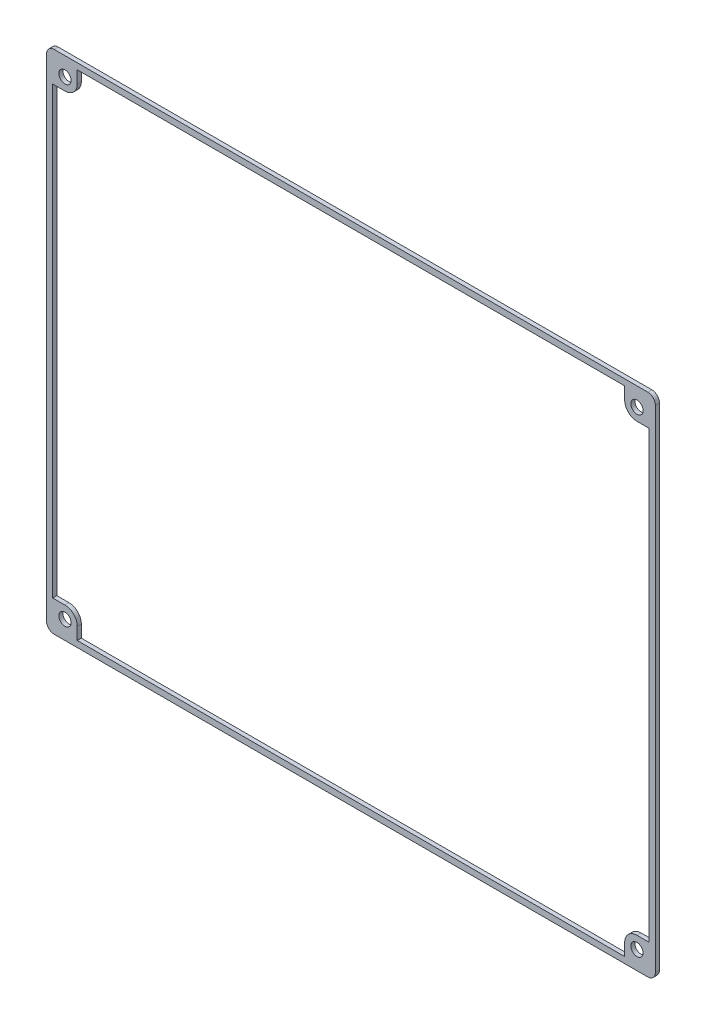
ISO-10303-21;
HEADER;
FILE_DESCRIPTION(('STEP AP214'),'2;1');
FILE_NAME('part.step','',(''),(''),'','','');
FILE_SCHEMA(('AUTOMOTIVE_DESIGN { 1 0 10303 214 1 1 1 1 }'));
ENDSEC;
DATA;
#1=APPLICATION_CONTEXT('core data for automotive mechanical design processes');
#2=APPLICATION_PROTOCOL_DEFINITION('international standard','automotive_design',2000,#1);
#3=PRODUCT_CONTEXT('',#1,'mechanical');
#4=PRODUCT('Part','Part','',(#3));
#5=PRODUCT_RELATED_PRODUCT_CATEGORY('part','',(#4));
#6=PRODUCT_DEFINITION_FORMATION('','',#4);
#7=PRODUCT_DEFINITION_CONTEXT('part definition',#1,'design');
#8=PRODUCT_DEFINITION('design','',#6,#7);
#9=PRODUCT_DEFINITION_SHAPE('','',#8);
#10=(LENGTH_UNIT() NAMED_UNIT(*) SI_UNIT(.MILLI.,.METRE.));
#11=(NAMED_UNIT(*) PLANE_ANGLE_UNIT() SI_UNIT($,.RADIAN.));
#12=(NAMED_UNIT(*) SI_UNIT($,.STERADIAN.) SOLID_ANGLE_UNIT());
#13=UNCERTAINTY_MEASURE_WITH_UNIT(LENGTH_MEASURE(1.E-05),#10,'distance_accuracy_value','');
#14=(GEOMETRIC_REPRESENTATION_CONTEXT(3) GLOBAL_UNCERTAINTY_ASSIGNED_CONTEXT((#13)) GLOBAL_UNIT_ASSIGNED_CONTEXT((#10,
#11,#12)) REPRESENTATION_CONTEXT('',''));
#15=CARTESIAN_POINT('',(0.,0.,0.));
#16=DIRECTION('',(0.,0.,1.));
#17=DIRECTION('',(1.,0.,0.));
#18=AXIS2_PLACEMENT_3D('',#15,#16,#17);
#19=CARTESIAN_POINT('',(-2.35922392732846E-13,240.,2.));
#20=DIRECTION('',(0.,0.,1.));
#21=DIRECTION('',(1.,0.,0.));
#22=AXIS2_PLACEMENT_3D('',#19,#20,#21);
#23=PLANE('',#22);
#24=DIRECTION('',(0.,1.,0.));
#25=VECTOR('',#24,1.);
#26=CARTESIAN_POINT('',(278.7366,234.7366,2.));
#27=LINE('',#26,#25);
#28=CARTESIAN_POINT('',(278.7366,234.7366,2.));
#29=VERTEX_POINT('',#28);
#30=CARTESIAN_POINT('',(278.7366,240.7366,2.));
#31=VERTEX_POINT('',#30);
#32=EDGE_CURVE('E210',#29,#31,#27,.T.);
#33=ORIENTED_EDGE('',*,*,#32,.F.);
#34=CARTESIAN_POINT('',(284.7366,234.7366,2.));
#35=DIRECTION('',(0.,0.,-1.));
#36=DIRECTION('',(1.,0.,0.));
#37=AXIS2_PLACEMENT_3D('',#34,#35,#36);
#38=CIRCLE('',#37,5.99999999999999);
#39=CARTESIAN_POINT('',(284.7366,228.7366,2.));
#40=VERTEX_POINT('',#39);
#41=EDGE_CURVE('E201',#40,#29,#38,.T.);
#42=ORIENTED_EDGE('',*,*,#41,.F.);
#43=DIRECTION('',(-1.,0.,0.));
#44=VECTOR('',#43,1.);
#45=CARTESIAN_POINT('',(284.7366,228.7366,2.));
#46=LINE('',#45,#44);
#47=CARTESIAN_POINT('',(290.7366,228.7366,2.));
#48=VERTEX_POINT('',#47);
#49=EDGE_CURVE('E269',#48,#40,#46,.T.);
#50=ORIENTED_EDGE('',*,*,#49,.F.);
#51=DIRECTION('',(0.,1.,0.));
#52=VECTOR('',#51,1.);
#53=CARTESIAN_POINT('',(290.7366,228.7366,2.));
#54=LINE('',#53,#52);
#55=CARTESIAN_POINT('',(290.7366,11.2634,2.));
#56=VERTEX_POINT('',#55);
#57=EDGE_CURVE('E266',#56,#48,#54,.T.);
#58=ORIENTED_EDGE('',*,*,#57,.F.);
#59=DIRECTION('',(1.,0.,0.));
#60=VECTOR('',#59,1.);
#61=CARTESIAN_POINT('',(284.7366,11.2634,2.));
#62=LINE('',#61,#60);
#63=CARTESIAN_POINT('',(284.7366,11.2634,2.));
#64=VERTEX_POINT('',#63);
#65=EDGE_CURVE('E263',#64,#56,#62,.T.);
#66=ORIENTED_EDGE('',*,*,#65,.F.);
#67=CARTESIAN_POINT('',(284.7366,5.2634,2.));
#68=DIRECTION('',(0.,0.,-1.));
#69=DIRECTION('',(1.,0.,0.));
#70=AXIS2_PLACEMENT_3D('',#67,#68,#69);
#71=CIRCLE('',#70,5.99999999999999);
#72=CARTESIAN_POINT('',(278.7366,5.2634,2.));
#73=VERTEX_POINT('',#72);
#74=EDGE_CURVE('E260',#73,#64,#71,.T.);
#75=ORIENTED_EDGE('',*,*,#74,.F.);
#76=DIRECTION('',(0.,1.,0.));
#77=VECTOR('',#76,1.);
#78=CARTESIAN_POINT('',(278.7366,5.2634,2.));
#79=LINE('',#78,#77);
#80=CARTESIAN_POINT('',(278.7366,-0.736599999999976,2.));
#81=VERTEX_POINT('',#80);
#82=EDGE_CURVE('E257',#81,#73,#79,.T.);
#83=ORIENTED_EDGE('',*,*,#82,.F.);
#84=DIRECTION('',(1.,0.,0.));
#85=VECTOR('',#84,1.);
#86=CARTESIAN_POINT('',(278.7366,-0.736599999999976,2.));
#87=LINE('',#86,#85);
#88=CARTESIAN_POINT('',(11.2633999999998,-0.73660000000017,2.));
#89=VERTEX_POINT('',#88);
#90=EDGE_CURVE('E254',#89,#81,#87,.T.);
#91=ORIENTED_EDGE('',*,*,#90,.F.);
#92=DIRECTION('',(0.,-1.,0.));
#93=VECTOR('',#92,1.);
#94=CARTESIAN_POINT('',(11.2633999999998,5.26339999999989,2.));
#95=LINE('',#94,#93);
#96=CARTESIAN_POINT('',(11.2633999999997,5.26339999999989,2.));
#97=VERTEX_POINT('',#96);
#98=EDGE_CURVE('E251',#97,#89,#95,.T.);
#99=ORIENTED_EDGE('',*,*,#98,.F.);
#100=CARTESIAN_POINT('',(5.26339999999978,5.2634,2.));
#101=DIRECTION('',(0.,0.,-1.));
#102=DIRECTION('',(1.,0.,0.));
#103=AXIS2_PLACEMENT_3D('',#100,#101,#102);
#104=CIRCLE('',#103,5.99999999999992);
#105=CARTESIAN_POINT('',(5.26339999999978,11.2633999999998,2.));
#106=VERTEX_POINT('',#105);
#107=EDGE_CURVE('E248',#106,#97,#104,.T.);
#108=ORIENTED_EDGE('',*,*,#107,.F.);
#109=DIRECTION('',(1.,0.,0.));
#110=VECTOR('',#109,1.);
#111=CARTESIAN_POINT('',(5.26339999999978,11.2633999999998,2.));
#112=LINE('',#111,#110);
#113=CARTESIAN_POINT('',(-0.736600000000254,11.2633999999998,2.));
#114=VERTEX_POINT('',#113);
#115=EDGE_CURVE('E245',#114,#106,#112,.T.);
#116=ORIENTED_EDGE('',*,*,#115,.F.);
#117=DIRECTION('',(0.,-1.,0.));
#118=VECTOR('',#117,1.);
#119=CARTESIAN_POINT('',(-0.736600000000254,11.2633999999998,2.));
#120=LINE('',#119,#118);
#121=CARTESIAN_POINT('',(-0.736600000000309,228.7366,2.));
#122=VERTEX_POINT('',#121);
#123=EDGE_CURVE('E242',#122,#114,#120,.T.);
#124=ORIENTED_EDGE('',*,*,#123,.F.);
#125=DIRECTION('',(-1.,0.,0.));
#126=VECTOR('',#125,1.);
#127=CARTESIAN_POINT('',(5.26339999999981,228.7366,2.));
#128=LINE('',#127,#126);
#129=CARTESIAN_POINT('',(5.26339999999981,228.7366,2.));
#130=VERTEX_POINT('',#129);
#131=EDGE_CURVE('E239',#130,#122,#128,.T.);
#132=ORIENTED_EDGE('',*,*,#131,.F.);
#133=CARTESIAN_POINT('',(5.26339999999978,234.7366,2.));
#134=DIRECTION('',(0.,0.,-1.));
#135=DIRECTION('',(1.,0.,0.));
#136=AXIS2_PLACEMENT_3D('',#133,#134,#135);
#137=CIRCLE('',#136,5.99999999999998);
#138=CARTESIAN_POINT('',(11.2633999999998,234.7366,2.));
#139=VERTEX_POINT('',#138);
#140=EDGE_CURVE('E236',#139,#130,#137,.T.);
#141=ORIENTED_EDGE('',*,*,#140,.F.);
#142=DIRECTION('',(0.,-1.,0.));
#143=VECTOR('',#142,1.);
#144=CARTESIAN_POINT('',(11.2633999999998,234.7366,2.));
#145=LINE('',#144,#143);
#146=CARTESIAN_POINT('',(11.2633999999998,240.7366,2.));
#147=VERTEX_POINT('',#146);
#148=EDGE_CURVE('E230',#147,#139,#145,.T.);
#149=ORIENTED_EDGE('',*,*,#148,.F.);
#150=DIRECTION('',(-1.,0.,0.));
#151=VECTOR('',#150,1.);
#152=CARTESIAN_POINT('',(11.2633999999998,240.7366,2.));
#153=LINE('',#152,#151);
#154=EDGE_CURVE('E225',#31,#147,#153,.T.);
#155=ORIENTED_EDGE('',*,*,#154,.F.);
#156=EDGE_LOOP('',(#33,#42,#50,#58,#66,#75,#83,#91,#99,#108,#116,#124,#132,#141,#149,#155));
#157=FACE_BOUND('',#156,.T.);
#158=CARTESIAN_POINT('',(284.7366,234.7366,2.));
#159=DIRECTION('',(0.,0.,1.));
#160=DIRECTION('',(1.,0.,0.));
#161=AXIS2_PLACEMENT_3D('',#158,#159,#160);
#162=CIRCLE('',#161,2.99999999999999);
#163=CARTESIAN_POINT('',(287.7366,234.7366,2.));
#164=VERTEX_POINT('',#163);
#165=EDGE_CURVE('E374',#164,#164,#162,.T.);
#166=ORIENTED_EDGE('',*,*,#165,.F.);
#167=EDGE_LOOP('',(#166));
#168=FACE_BOUND('',#167,.T.);
#169=CARTESIAN_POINT('',(5.26339999999978,234.7366,2.));
#170=DIRECTION('',(0.,0.,1.));
#171=DIRECTION('',(1.,0.,0.));
#172=AXIS2_PLACEMENT_3D('',#169,#170,#171);
#173=CIRCLE('',#172,3.);
#174=CARTESIAN_POINT('',(8.26339999999978,234.7366,2.));
#175=VERTEX_POINT('',#174);
#176=EDGE_CURVE('E390',#175,#175,#173,.T.);
#177=ORIENTED_EDGE('',*,*,#176,.F.);
#178=EDGE_LOOP('',(#177));
#179=FACE_BOUND('',#178,.T.);
#180=CARTESIAN_POINT('',(-2.35922392732846E-13,240.,2.));
#181=DIRECTION('',(0.,0.,1.));
#182=DIRECTION('',(1.,0.,0.));
#183=AXIS2_PLACEMENT_3D('',#180,#181,#182);
#184=CIRCLE('',#183,3.73660000000001);
#185=CARTESIAN_POINT('',(-1.2220184685951E-13,243.7366,2.));
#186=VERTEX_POINT('',#185);
#187=CARTESIAN_POINT('',(-3.73660000000024,240.,2.));
#188=VERTEX_POINT('',#187);
#189=EDGE_CURVE('E398',#186,#188,#184,.T.);
#190=ORIENTED_EDGE('',*,*,#189,.T.);
#191=DIRECTION('',(0.,-1.,0.));
#192=VECTOR('',#191,1.);
#193=CARTESIAN_POINT('',(-3.73660000000024,240.,2.));
#194=LINE('',#193,#192);
#195=CARTESIAN_POINT('',(-3.73660000000024,0.,2.));
#196=VERTEX_POINT('',#195);
#197=EDGE_CURVE('E402',#188,#196,#194,.T.);
#198=ORIENTED_EDGE('',*,*,#197,.T.);
#199=CARTESIAN_POINT('',(0.,0.,2.));
#200=DIRECTION('',(0.,0.,1.));
#201=DIRECTION('',(-1.,0.,0.));
#202=AXIS2_PLACEMENT_3D('',#199,#200,#201);
#203=CIRCLE('',#202,3.73660000000006);
#204=CARTESIAN_POINT('',(-1.22405534359051E-13,-3.73660000000009,2.));
#205=VERTEX_POINT('',#204);
#206=EDGE_CURVE('E406',#196,#205,#203,.T.);
#207=ORIENTED_EDGE('',*,*,#206,.T.);
#208=DIRECTION('',(1.,0.,0.));
#209=VECTOR('',#208,1.);
#210=CARTESIAN_POINT('',(-1.2220184685951E-13,-3.7366,2.));
#211=LINE('',#210,#209);
#212=CARTESIAN_POINT('',(290.,-3.7366,2.));
#213=VERTEX_POINT('',#212);
#214=EDGE_CURVE('E409',#205,#213,#211,.T.);
#215=ORIENTED_EDGE('',*,*,#214,.T.);
#216=CARTESIAN_POINT('',(290.,0.,2.));
#217=DIRECTION('',(0.,0.,1.));
#218=DIRECTION('',(1.,0.,0.));
#219=AXIS2_PLACEMENT_3D('',#216,#217,#218);
#220=CIRCLE('',#219,3.73660000000002);
#221=CARTESIAN_POINT('',(293.7366,0.,2.));
#222=VERTEX_POINT('',#221);
#223=EDGE_CURVE('E412',#213,#222,#220,.T.);
#224=ORIENTED_EDGE('',*,*,#223,.T.);
#225=DIRECTION('',(0.,1.,0.));
#226=VECTOR('',#225,1.);
#227=CARTESIAN_POINT('',(293.7366,0.,2.));
#228=LINE('',#227,#226);
#229=CARTESIAN_POINT('',(293.7366,240.,2.));
#230=VERTEX_POINT('',#229);
#231=EDGE_CURVE('E415',#222,#230,#228,.T.);
#232=ORIENTED_EDGE('',*,*,#231,.T.);
#233=CARTESIAN_POINT('',(290.,240.,2.));
#234=DIRECTION('',(0.,0.,1.));
#235=DIRECTION('',(-1.,0.,0.));
#236=AXIS2_PLACEMENT_3D('',#233,#234,#235);
#237=CIRCLE('',#236,3.73660000000002);
#238=CARTESIAN_POINT('',(290.,243.7366,2.));
#239=VERTEX_POINT('',#238);
#240=EDGE_CURVE('E418',#230,#239,#237,.T.);
#241=ORIENTED_EDGE('',*,*,#240,.T.);
#242=DIRECTION('',(-1.,0.,0.));
#243=VECTOR('',#242,1.);
#244=CARTESIAN_POINT('',(-1.2220184685951E-13,243.7366,2.));
#245=LINE('',#244,#243);
#246=EDGE_CURVE('E421',#239,#186,#245,.T.);
#247=ORIENTED_EDGE('',*,*,#246,.T.);
#248=EDGE_LOOP('',(#190,#198,#207,#215,#224,#232,#241,#247));
#249=FACE_BOUND('',#248,.T.);
#250=CARTESIAN_POINT('',(284.7366,5.2634,2.));
#251=DIRECTION('',(0.,0.,1.));
#252=DIRECTION('',(1.,0.,0.));
#253=AXIS2_PLACEMENT_3D('',#250,#251,#252);
#254=CIRCLE('',#253,2.99999999999999);
#255=CARTESIAN_POINT('',(287.7366,5.2634,2.));
#256=VERTEX_POINT('',#255);
#257=EDGE_CURVE('E382',#256,#256,#254,.T.);
#258=ORIENTED_EDGE('',*,*,#257,.F.);
#259=EDGE_LOOP('',(#258));
#260=FACE_BOUND('',#259,.T.);
#261=CARTESIAN_POINT('',(5.26339999999978,5.2634,2.));
#262=DIRECTION('',(0.,0.,1.));
#263=DIRECTION('',(1.,0.,0.));
#264=AXIS2_PLACEMENT_3D('',#261,#262,#263);
#265=CIRCLE('',#264,3.);
#266=CARTESIAN_POINT('',(8.26339999999978,5.2634,2.));
#267=VERTEX_POINT('',#266);
#268=EDGE_CURVE('E274',#267,#267,#265,.T.);
#269=ORIENTED_EDGE('',*,*,#268,.F.);
#270=EDGE_LOOP('',(#269));
#271=FACE_BOUND('',#270,.T.);
#272=ADVANCED_FACE('F39',(#157,#168,#179,#249,#260,#271),#23,.T.);
#273=CARTESIAN_POINT('',(-2.35922392732846E-13,240.,0.));
#274=DIRECTION('',(0.,0.,1.));
#275=DIRECTION('',(1.,0.,0.));
#276=AXIS2_PLACEMENT_3D('',#273,#274,#275);
#277=PLANE('',#276);
#278=CARTESIAN_POINT('',(284.7366,234.7366,0.));
#279=DIRECTION('',(0.,0.,1.));
#280=DIRECTION('',(1.,0.,0.));
#281=AXIS2_PLACEMENT_3D('',#278,#279,#280);
#282=CIRCLE('',#281,2.99999999999999);
#283=CARTESIAN_POINT('',(287.7366,234.7366,0.));
#284=VERTEX_POINT('',#283);
#285=EDGE_CURVE('E219',#284,#284,#282,.T.);
#286=ORIENTED_EDGE('',*,*,#285,.T.);
#287=EDGE_LOOP('',(#286));
#288=FACE_BOUND('',#287,.T.);
#289=CARTESIAN_POINT('',(284.7366,5.2634,0.));
#290=DIRECTION('',(0.,0.,1.));
#291=DIRECTION('',(1.,0.,0.));
#292=AXIS2_PLACEMENT_3D('',#289,#290,#291);
#293=CIRCLE('',#292,2.99999999999999);
#294=CARTESIAN_POINT('',(287.7366,5.2634,0.));
#295=VERTEX_POINT('',#294);
#296=EDGE_CURVE('E378',#295,#295,#293,.T.);
#297=ORIENTED_EDGE('',*,*,#296,.T.);
#298=EDGE_LOOP('',(#297));
#299=FACE_BOUND('',#298,.T.);
#300=CARTESIAN_POINT('',(5.26339999999978,234.7366,0.));
#301=DIRECTION('',(0.,0.,1.));
#302=DIRECTION('',(1.,0.,0.));
#303=AXIS2_PLACEMENT_3D('',#300,#301,#302);
#304=CIRCLE('',#303,3.);
#305=CARTESIAN_POINT('',(8.26339999999978,234.7366,0.));
#306=VERTEX_POINT('',#305);
#307=EDGE_CURVE('E386',#306,#306,#304,.T.);
#308=ORIENTED_EDGE('',*,*,#307,.T.);
#309=EDGE_LOOP('',(#308));
#310=FACE_BOUND('',#309,.T.);
#311=CARTESIAN_POINT('',(-2.35922392732846E-13,240.,0.));
#312=DIRECTION('',(0.,0.,1.));
#313=DIRECTION('',(1.,0.,0.));
#314=AXIS2_PLACEMENT_3D('',#311,#312,#313);
#315=CIRCLE('',#314,3.73660000000001);
#316=CARTESIAN_POINT('',(-1.2220184685951E-13,243.7366,0.));
#317=VERTEX_POINT('',#316);
#318=CARTESIAN_POINT('',(-3.73660000000024,240.,0.));
#319=VERTEX_POINT('',#318);
#320=EDGE_CURVE('E394',#317,#319,#315,.T.);
#321=ORIENTED_EDGE('',*,*,#320,.F.);
#322=DIRECTION('',(-1.,0.,0.));
#323=VECTOR('',#322,1.);
#324=CARTESIAN_POINT('',(-1.2220184685951E-13,243.7366,0.));
#325=LINE('',#324,#323);
#326=CARTESIAN_POINT('',(290.,243.7366,0.));
#327=VERTEX_POINT('',#326);
#328=EDGE_CURVE('E403',#327,#317,#325,.T.);
#329=ORIENTED_EDGE('',*,*,#328,.F.);
#330=CARTESIAN_POINT('',(290.,240.,0.));
#331=DIRECTION('',(0.,0.,1.));
#332=DIRECTION('',(-1.,0.,0.));
#333=AXIS2_PLACEMENT_3D('',#330,#331,#332);
#334=CIRCLE('',#333,3.73660000000002);
#335=CARTESIAN_POINT('',(293.7366,240.,0.));
#336=VERTEX_POINT('',#335);
#337=EDGE_CURVE('E443',#336,#327,#334,.T.);
#338=ORIENTED_EDGE('',*,*,#337,.F.);
#339=DIRECTION('',(0.,1.,0.));
#340=VECTOR('',#339,1.);
#341=CARTESIAN_POINT('',(293.7366,0.,0.));
#342=LINE('',#341,#340);
#343=CARTESIAN_POINT('',(293.7366,0.,0.));
#344=VERTEX_POINT('',#343);
#345=EDGE_CURVE('E440',#344,#336,#342,.T.);
#346=ORIENTED_EDGE('',*,*,#345,.F.);
#347=CARTESIAN_POINT('',(290.,0.,0.));
#348=DIRECTION('',(0.,0.,1.));
#349=DIRECTION('',(1.,0.,0.));
#350=AXIS2_PLACEMENT_3D('',#347,#348,#349);
#351=CIRCLE('',#350,3.73660000000002);
#352=CARTESIAN_POINT('',(290.,-3.7366,0.));
#353=VERTEX_POINT('',#352);
#354=EDGE_CURVE('E437',#353,#344,#351,.T.);
#355=ORIENTED_EDGE('',*,*,#354,.F.);
#356=DIRECTION('',(1.,0.,0.));
#357=VECTOR('',#356,1.);
#358=CARTESIAN_POINT('',(-1.2220184685951E-13,-3.7366,0.));
#359=LINE('',#358,#357);
#360=CARTESIAN_POINT('',(-1.22405534359051E-13,-3.73660000000009,0.));
#361=VERTEX_POINT('',#360);
#362=EDGE_CURVE('E434',#361,#353,#359,.T.);
#363=ORIENTED_EDGE('',*,*,#362,.F.);
#364=CARTESIAN_POINT('',(0.,0.,0.));
#365=DIRECTION('',(0.,0.,1.));
#366=DIRECTION('',(-1.,0.,0.));
#367=AXIS2_PLACEMENT_3D('',#364,#365,#366);
#368=CIRCLE('',#367,3.73660000000006);
#369=CARTESIAN_POINT('',(-3.73660000000024,0.,0.));
#370=VERTEX_POINT('',#369);
#371=EDGE_CURVE('E431',#370,#361,#368,.T.);
#372=ORIENTED_EDGE('',*,*,#371,.F.);
#373=DIRECTION('',(0.,-1.,0.));
#374=VECTOR('',#373,1.);
#375=CARTESIAN_POINT('',(-3.73660000000024,240.,0.));
#376=LINE('',#375,#374);
#377=EDGE_CURVE('E428',#319,#370,#376,.T.);
#378=ORIENTED_EDGE('',*,*,#377,.F.);
#379=EDGE_LOOP('',(#321,#329,#338,#346,#355,#363,#372,#378));
#380=FACE_BOUND('',#379,.T.);
#381=CARTESIAN_POINT('',(284.7366,234.7366,0.));
#382=DIRECTION('',(0.,0.,-1.));
#383=DIRECTION('',(1.,0.,0.));
#384=AXIS2_PLACEMENT_3D('',#381,#382,#383);
#385=CIRCLE('',#384,5.99999999999999);
#386=CARTESIAN_POINT('',(284.7366,228.7366,0.));
#387=VERTEX_POINT('',#386);
#388=CARTESIAN_POINT('',(278.7366,234.7366,0.));
#389=VERTEX_POINT('',#388);
#390=EDGE_CURVE('E63',#387,#389,#385,.T.);
#391=ORIENTED_EDGE('',*,*,#390,.T.);
#392=DIRECTION('',(0.,1.,0.));
#393=VECTOR('',#392,1.);
#394=CARTESIAN_POINT('',(278.7366,234.7366,0.));
#395=LINE('',#394,#393);
#396=CARTESIAN_POINT('',(278.7366,240.7366,0.));
#397=VERTEX_POINT('',#396);
#398=EDGE_CURVE('E217',#389,#397,#395,.T.);
#399=ORIENTED_EDGE('',*,*,#398,.T.);
#400=DIRECTION('',(-1.,0.,0.));
#401=VECTOR('',#400,1.);
#402=CARTESIAN_POINT('',(11.2633999999998,240.7366,0.));
#403=LINE('',#402,#401);
#404=CARTESIAN_POINT('',(11.2633999999998,240.7366,0.));
#405=VERTEX_POINT('',#404);
#406=EDGE_CURVE('E277',#397,#405,#403,.T.);
#407=ORIENTED_EDGE('',*,*,#406,.T.);
#408=DIRECTION('',(0.,-1.,0.));
#409=VECTOR('',#408,1.);
#410=CARTESIAN_POINT('',(11.2633999999998,234.7366,0.));
#411=LINE('',#410,#409);
#412=CARTESIAN_POINT('',(11.2633999999998,234.7366,0.));
#413=VERTEX_POINT('',#412);
#414=EDGE_CURVE('E281',#405,#413,#411,.T.);
#415=ORIENTED_EDGE('',*,*,#414,.T.);
#416=CARTESIAN_POINT('',(5.26339999999978,234.7366,0.));
#417=DIRECTION('',(0.,0.,-1.));
#418=DIRECTION('',(1.,0.,0.));
#419=AXIS2_PLACEMENT_3D('',#416,#417,#418);
#420=CIRCLE('',#419,5.99999999999998);
#421=CARTESIAN_POINT('',(5.26339999999981,228.7366,0.));
#422=VERTEX_POINT('',#421);
#423=EDGE_CURVE('E285',#413,#422,#420,.T.);
#424=ORIENTED_EDGE('',*,*,#423,.T.);
#425=DIRECTION('',(-1.,0.,0.));
#426=VECTOR('',#425,1.);
#427=CARTESIAN_POINT('',(5.26339999999981,228.7366,0.));
#428=LINE('',#427,#426);
#429=CARTESIAN_POINT('',(-0.736600000000309,228.7366,0.));
#430=VERTEX_POINT('',#429);
#431=EDGE_CURVE('E289',#422,#430,#428,.T.);
#432=ORIENTED_EDGE('',*,*,#431,.T.);
#433=DIRECTION('',(0.,-1.,0.));
#434=VECTOR('',#433,1.);
#435=CARTESIAN_POINT('',(-0.736600000000254,11.2633999999998,0.));
#436=LINE('',#435,#434);
#437=CARTESIAN_POINT('',(-0.736600000000254,11.2633999999998,0.));
#438=VERTEX_POINT('',#437);
#439=EDGE_CURVE('E293',#430,#438,#436,.T.);
#440=ORIENTED_EDGE('',*,*,#439,.T.);
#441=DIRECTION('',(1.,0.,0.));
#442=VECTOR('',#441,1.);
#443=CARTESIAN_POINT('',(5.26339999999978,11.2633999999998,0.));
#444=LINE('',#443,#442);
#445=CARTESIAN_POINT('',(5.26339999999978,11.2633999999998,0.));
#446=VERTEX_POINT('',#445);
#447=EDGE_CURVE('E297',#438,#446,#444,.T.);
#448=ORIENTED_EDGE('',*,*,#447,.T.);
#449=CARTESIAN_POINT('',(5.26339999999978,5.2634,0.));
#450=DIRECTION('',(0.,0.,-1.));
#451=DIRECTION('',(1.,0.,0.));
#452=AXIS2_PLACEMENT_3D('',#449,#450,#451);
#453=CIRCLE('',#452,5.99999999999992);
#454=CARTESIAN_POINT('',(11.2633999999997,5.26339999999989,0.));
#455=VERTEX_POINT('',#454);
#456=EDGE_CURVE('E301',#446,#455,#453,.T.);
#457=ORIENTED_EDGE('',*,*,#456,.T.);
#458=DIRECTION('',(0.,-1.,0.));
#459=VECTOR('',#458,1.);
#460=CARTESIAN_POINT('',(11.2633999999998,5.26339999999989,0.));
#461=LINE('',#460,#459);
#462=CARTESIAN_POINT('',(11.2633999999998,-0.73660000000017,0.));
#463=VERTEX_POINT('',#462);
#464=EDGE_CURVE('E305',#455,#463,#461,.T.);
#465=ORIENTED_EDGE('',*,*,#464,.T.);
#466=DIRECTION('',(1.,0.,0.));
#467=VECTOR('',#466,1.);
#468=CARTESIAN_POINT('',(278.7366,-0.736599999999976,0.));
#469=LINE('',#468,#467);
#470=CARTESIAN_POINT('',(278.7366,-0.736599999999976,0.));
#471=VERTEX_POINT('',#470);
#472=EDGE_CURVE('E309',#463,#471,#469,.T.);
#473=ORIENTED_EDGE('',*,*,#472,.T.);
#474=DIRECTION('',(0.,1.,0.));
#475=VECTOR('',#474,1.);
#476=CARTESIAN_POINT('',(278.7366,5.2634,0.));
#477=LINE('',#476,#475);
#478=CARTESIAN_POINT('',(278.7366,5.2634,0.));
#479=VERTEX_POINT('',#478);
#480=EDGE_CURVE('E313',#471,#479,#477,.T.);
#481=ORIENTED_EDGE('',*,*,#480,.T.);
#482=CARTESIAN_POINT('',(284.7366,5.2634,0.));
#483=DIRECTION('',(0.,0.,-1.));
#484=DIRECTION('',(1.,0.,0.));
#485=AXIS2_PLACEMENT_3D('',#482,#483,#484);
#486=CIRCLE('',#485,5.99999999999999);
#487=CARTESIAN_POINT('',(284.7366,11.2634,0.));
#488=VERTEX_POINT('',#487);
#489=EDGE_CURVE('E317',#479,#488,#486,.T.);
#490=ORIENTED_EDGE('',*,*,#489,.T.);
#491=DIRECTION('',(1.,0.,0.));
#492=VECTOR('',#491,1.);
#493=CARTESIAN_POINT('',(284.7366,11.2634,0.));
#494=LINE('',#493,#492);
#495=CARTESIAN_POINT('',(290.7366,11.2634,0.));
#496=VERTEX_POINT('',#495);
#497=EDGE_CURVE('E321',#488,#496,#494,.T.);
#498=ORIENTED_EDGE('',*,*,#497,.T.);
#499=DIRECTION('',(0.,1.,0.));
#500=VECTOR('',#499,1.);
#501=CARTESIAN_POINT('',(290.7366,228.7366,0.));
#502=LINE('',#501,#500);
#503=CARTESIAN_POINT('',(290.7366,228.7366,0.));
#504=VERTEX_POINT('',#503);
#505=EDGE_CURVE('E325',#496,#504,#502,.T.);
#506=ORIENTED_EDGE('',*,*,#505,.T.);
#507=DIRECTION('',(-1.,0.,0.));
#508=VECTOR('',#507,1.);
#509=CARTESIAN_POINT('',(284.7366,228.7366,0.));
#510=LINE('',#509,#508);
#511=EDGE_CURVE('E211',#504,#387,#510,.T.);
#512=ORIENTED_EDGE('',*,*,#511,.T.);
#513=EDGE_LOOP('',(#391,#399,#407,#415,#424,#432,#440,#448,#457,#465,#473,#481,#490,#498,#506,#512));
#514=FACE_BOUND('',#513,.T.);
#515=CARTESIAN_POINT('',(5.26339999999978,5.2634,0.));
#516=DIRECTION('',(0.,0.,1.));
#517=DIRECTION('',(1.,0.,0.));
#518=AXIS2_PLACEMENT_3D('',#515,#516,#517);
#519=CIRCLE('',#518,3.);
#520=CARTESIAN_POINT('',(8.26339999999978,5.2634,0.));
#521=VERTEX_POINT('',#520);
#522=EDGE_CURVE('E626',#521,#521,#519,.T.);
#523=ORIENTED_EDGE('',*,*,#522,.T.);
#524=EDGE_LOOP('',(#523));
#525=FACE_BOUND('',#524,.T.);
#526=ADVANCED_FACE('F483',(#288,#299,#310,#380,#514,#525),#277,.F.);
#527=CARTESIAN_POINT('',(-2.35922392732846E-13,240.,2.));
#528=DIRECTION('',(0.,0.,-1.));
#529=DIRECTION('',(-1.,0.,0.));
#530=AXIS2_PLACEMENT_3D('',#527,#528,#529);
#531=CYLINDRICAL_SURFACE('',#530,3.73660000000001);
#532=ORIENTED_EDGE('',*,*,#320,.T.);
#533=DIRECTION('',(0.,0.,-1.));
#534=VECTOR('',#533,1.);
#535=CARTESIAN_POINT('',(-3.73660000000024,240.,2.));
#536=LINE('',#535,#534);
#537=EDGE_CURVE('E11',#188,#319,#536,.T.);
#538=ORIENTED_EDGE('',*,*,#537,.F.);
#539=ORIENTED_EDGE('',*,*,#189,.F.);
#540=DIRECTION('',(0.,0.,-1.));
#541=VECTOR('',#540,1.);
#542=CARTESIAN_POINT('',(-1.2220184685951E-13,243.7366,2.));
#543=LINE('',#542,#541);
#544=EDGE_CURVE('E424',#186,#317,#543,.T.);
#545=ORIENTED_EDGE('',*,*,#544,.T.);
#546=EDGE_LOOP('',(#532,#538,#539,#545));
#547=FACE_BOUND('',#546,.T.);
#548=ADVANCED_FACE('F41',(#547),#531,.T.);
#549=CARTESIAN_POINT('',(-3.73660000000024,240.,2.));
#550=DIRECTION('',(1.,0.,0.));
#551=DIRECTION('',(0.,0.,-1.));
#552=AXIS2_PLACEMENT_3D('',#549,#550,#551);
#553=PLANE('',#552);
#554=ORIENTED_EDGE('',*,*,#377,.T.);
#555=DIRECTION('',(0.,0.,-1.));
#556=VECTOR('',#555,1.);
#557=CARTESIAN_POINT('',(-3.73660000000024,0.,2.));
#558=LINE('',#557,#556);
#559=EDGE_CURVE('E48',#196,#370,#558,.T.);
#560=ORIENTED_EDGE('',*,*,#559,.F.);
#561=ORIENTED_EDGE('',*,*,#197,.F.);
#562=ORIENTED_EDGE('',*,*,#537,.T.);
#563=EDGE_LOOP('',(#554,#560,#561,#562));
#564=FACE_BOUND('',#563,.T.);
#565=ADVANCED_FACE('F501',(#564),#553,.F.);
#566=CARTESIAN_POINT('',(0.,0.,2.));
#567=DIRECTION('',(0.,0.,-1.));
#568=DIRECTION('',(-1.,0.,0.));
#569=AXIS2_PLACEMENT_3D('',#566,#567,#568);
#570=CYLINDRICAL_SURFACE('',#569,3.73660000000006);
#571=ORIENTED_EDGE('',*,*,#371,.T.);
#572=DIRECTION('',(0.,0.,-1.));
#573=VECTOR('',#572,1.);
#574=CARTESIAN_POINT('',(-1.22405534359051E-13,-3.73660000000009,2.));
#575=LINE('',#574,#573);
#576=EDGE_CURVE('E467',#205,#361,#575,.T.);
#577=ORIENTED_EDGE('',*,*,#576,.F.);
#578=ORIENTED_EDGE('',*,*,#206,.F.);
#579=ORIENTED_EDGE('',*,*,#559,.T.);
#580=EDGE_LOOP('',(#571,#577,#578,#579));
#581=FACE_BOUND('',#580,.T.);
#582=ADVANCED_FACE('F477',(#581),#570,.T.);
#583=CARTESIAN_POINT('',(-1.2220184685951E-13,-3.7366,2.));
#584=DIRECTION('',(0.,1.,0.));
#585=DIRECTION('',(0.,0.,1.));
#586=AXIS2_PLACEMENT_3D('',#583,#584,#585);
#587=PLANE('',#586);
#588=ORIENTED_EDGE('',*,*,#362,.T.);
#589=DIRECTION('',(0.,0.,-1.));
#590=VECTOR('',#589,1.);
#591=CARTESIAN_POINT('',(290.,-3.7366,2.));
#592=LINE('',#591,#590);
#593=EDGE_CURVE('E463',#213,#353,#592,.T.);
#594=ORIENTED_EDGE('',*,*,#593,.F.);
#595=ORIENTED_EDGE('',*,*,#214,.F.);
#596=ORIENTED_EDGE('',*,*,#576,.T.);
#597=EDGE_LOOP('',(#588,#594,#595,#596));
#598=FACE_BOUND('',#597,.T.);
#599=ADVANCED_FACE('F489',(#598),#587,.F.);
#600=CARTESIAN_POINT('',(290.,0.,2.));
#601=DIRECTION('',(0.,0.,-1.));
#602=DIRECTION('',(-1.,0.,0.));
#603=AXIS2_PLACEMENT_3D('',#600,#601,#602);
#604=CYLINDRICAL_SURFACE('',#603,3.73660000000002);
#605=ORIENTED_EDGE('',*,*,#354,.T.);
#606=DIRECTION('',(0.,0.,-1.));
#607=VECTOR('',#606,1.);
#608=CARTESIAN_POINT('',(293.7366,0.,2.));
#609=LINE('',#608,#607);
#610=EDGE_CURVE('E459',#222,#344,#609,.T.);
#611=ORIENTED_EDGE('',*,*,#610,.F.);
#612=ORIENTED_EDGE('',*,*,#223,.F.);
#613=ORIENTED_EDGE('',*,*,#593,.T.);
#614=EDGE_LOOP('',(#605,#611,#612,#613));
#615=FACE_BOUND('',#614,.T.);
#616=ADVANCED_FACE('F493',(#615),#604,.T.);
#617=CARTESIAN_POINT('',(293.7366,0.,2.));
#618=DIRECTION('',(-1.,0.,0.));
#619=DIRECTION('',(0.,0.,1.));
#620=AXIS2_PLACEMENT_3D('',#617,#618,#619);
#621=PLANE('',#620);
#622=ORIENTED_EDGE('',*,*,#345,.T.);
#623=DIRECTION('',(0.,0.,-1.));
#624=VECTOR('',#623,1.);
#625=CARTESIAN_POINT('',(293.7366,240.,2.));
#626=LINE('',#625,#624);
#627=EDGE_CURVE('E455',#230,#336,#626,.T.);
#628=ORIENTED_EDGE('',*,*,#627,.F.);
#629=ORIENTED_EDGE('',*,*,#231,.F.);
#630=ORIENTED_EDGE('',*,*,#610,.T.);
#631=EDGE_LOOP('',(#622,#628,#629,#630));
#632=FACE_BOUND('',#631,.T.);
#633=ADVANCED_FACE('F514',(#632),#621,.F.);
#634=CARTESIAN_POINT('',(290.,240.,2.));
#635=DIRECTION('',(0.,0.,-1.));
#636=DIRECTION('',(-1.,0.,0.));
#637=AXIS2_PLACEMENT_3D('',#634,#635,#636);
#638=CYLINDRICAL_SURFACE('',#637,3.73660000000002);
#639=ORIENTED_EDGE('',*,*,#337,.T.);
#640=DIRECTION('',(0.,0.,-1.));
#641=VECTOR('',#640,1.);
#642=CARTESIAN_POINT('',(290.,243.7366,2.));
#643=LINE('',#642,#641);
#644=EDGE_CURVE('E451',#239,#327,#643,.T.);
#645=ORIENTED_EDGE('',*,*,#644,.F.);
#646=ORIENTED_EDGE('',*,*,#240,.F.);
#647=ORIENTED_EDGE('',*,*,#627,.T.);
#648=EDGE_LOOP('',(#639,#645,#646,#647));
#649=FACE_BOUND('',#648,.T.);
#650=ADVANCED_FACE('F512',(#649),#638,.T.);
#651=CARTESIAN_POINT('',(-1.2220184685951E-13,243.7366,2.));
#652=DIRECTION('',(0.,-1.,0.));
#653=DIRECTION('',(0.,0.,-1.));
#654=AXIS2_PLACEMENT_3D('',#651,#652,#653);
#655=PLANE('',#654);
#656=ORIENTED_EDGE('',*,*,#328,.T.);
#657=ORIENTED_EDGE('',*,*,#544,.F.);
#658=ORIENTED_EDGE('',*,*,#246,.F.);
#659=ORIENTED_EDGE('',*,*,#644,.T.);
#660=EDGE_LOOP('',(#656,#657,#658,#659));
#661=FACE_BOUND('',#660,.T.);
#662=ADVANCED_FACE('F507',(#661),#655,.F.);
#663=CARTESIAN_POINT('',(5.26339999999978,234.7366,2.));
#664=DIRECTION('',(0.,0.,-1.));
#665=DIRECTION('',(-1.,0.,0.));
#666=AXIS2_PLACEMENT_3D('',#663,#664,#665);
#667=CYLINDRICAL_SURFACE('',#666,3.);
#668=ORIENTED_EDGE('',*,*,#176,.T.);
#669=EDGE_LOOP('',(#668));
#670=FACE_BOUND('',#669,.T.);
#671=ORIENTED_EDGE('',*,*,#307,.F.);
#672=EDGE_LOOP('',(#671));
#673=FACE_BOUND('',#672,.T.);
#674=ADVANCED_FACE('F531',(#670,#673),#667,.F.);
#675=CARTESIAN_POINT('',(284.7366,5.2634,2.));
#676=DIRECTION('',(0.,0.,-1.));
#677=DIRECTION('',(-1.,0.,0.));
#678=AXIS2_PLACEMENT_3D('',#675,#676,#677);
#679=CYLINDRICAL_SURFACE('',#678,2.99999999999999);
#680=ORIENTED_EDGE('',*,*,#257,.T.);
#681=EDGE_LOOP('',(#680));
#682=FACE_BOUND('',#681,.T.);
#683=ORIENTED_EDGE('',*,*,#296,.F.);
#684=EDGE_LOOP('',(#683));
#685=FACE_BOUND('',#684,.T.);
#686=ADVANCED_FACE('F538',(#682,#685),#679,.F.);
#687=CARTESIAN_POINT('',(284.7366,234.7366,2.));
#688=DIRECTION('',(0.,0.,-1.));
#689=DIRECTION('',(-1.,0.,0.));
#690=AXIS2_PLACEMENT_3D('',#687,#688,#689);
#691=CYLINDRICAL_SURFACE('',#690,2.99999999999999);
#692=ORIENTED_EDGE('',*,*,#165,.T.);
#693=EDGE_LOOP('',(#692));
#694=FACE_BOUND('',#693,.T.);
#695=ORIENTED_EDGE('',*,*,#285,.F.);
#696=EDGE_LOOP('',(#695));
#697=FACE_BOUND('',#696,.T.);
#698=ADVANCED_FACE('F543',(#694,#697),#691,.F.);
#699=CARTESIAN_POINT('',(284.7366,234.7366,2.));
#700=DIRECTION('',(0.,0.,-1.));
#701=DIRECTION('',(-1.,0.,0.));
#702=AXIS2_PLACEMENT_3D('',#699,#700,#701);
#703=CYLINDRICAL_SURFACE('',#702,5.99999999999999);
#704=ORIENTED_EDGE('',*,*,#390,.F.);
#705=DIRECTION('',(0.,0.,-1.));
#706=VECTOR('',#705,1.);
#707=CARTESIAN_POINT('',(284.7366,228.7366,2.));
#708=LINE('',#707,#706);
#709=EDGE_CURVE('E205',#40,#387,#708,.T.);
#710=ORIENTED_EDGE('',*,*,#709,.F.);
#711=ORIENTED_EDGE('',*,*,#41,.T.);
#712=DIRECTION('',(0.,0.,-1.));
#713=VECTOR('',#712,1.);
#714=CARTESIAN_POINT('',(278.7366,234.7366,2.));
#715=LINE('',#714,#713);
#716=EDGE_CURVE('E204',#29,#389,#715,.T.);
#717=ORIENTED_EDGE('',*,*,#716,.T.);
#718=EDGE_LOOP('',(#704,#710,#711,#717));
#719=FACE_BOUND('',#718,.T.);
#720=ADVANCED_FACE('F203',(#719),#703,.T.);
#721=CARTESIAN_POINT('',(278.7366,234.7366,2.));
#722=DIRECTION('',(-1.,0.,0.));
#723=DIRECTION('',(0.,0.,1.));
#724=AXIS2_PLACEMENT_3D('',#721,#722,#723);
#725=PLANE('',#724);
#726=ORIENTED_EDGE('',*,*,#398,.F.);
#727=ORIENTED_EDGE('',*,*,#716,.F.);
#728=ORIENTED_EDGE('',*,*,#32,.T.);
#729=DIRECTION('',(0.,0.,-1.));
#730=VECTOR('',#729,1.);
#731=CARTESIAN_POINT('',(278.7366,240.7366,2.));
#732=LINE('',#731,#730);
#733=EDGE_CURVE('E220',#31,#397,#732,.T.);
#734=ORIENTED_EDGE('',*,*,#733,.T.);
#735=EDGE_LOOP('',(#726,#727,#728,#734));
#736=FACE_BOUND('',#735,.T.);
#737=ADVANCED_FACE('F214',(#736),#725,.T.);
#738=CARTESIAN_POINT('',(11.2633999999998,240.7366,2.));
#739=DIRECTION('',(0.,-1.,0.));
#740=DIRECTION('',(0.,0.,-1.));
#741=AXIS2_PLACEMENT_3D('',#738,#739,#740);
#742=PLANE('',#741);
#743=ORIENTED_EDGE('',*,*,#406,.F.);
#744=ORIENTED_EDGE('',*,*,#733,.F.);
#745=ORIENTED_EDGE('',*,*,#154,.T.);
#746=DIRECTION('',(0.,0.,-1.));
#747=VECTOR('',#746,1.);
#748=CARTESIAN_POINT('',(11.2633999999998,240.7366,2.));
#749=LINE('',#748,#747);
#750=EDGE_CURVE('E369',#147,#405,#749,.T.);
#751=ORIENTED_EDGE('',*,*,#750,.T.);
#752=EDGE_LOOP('',(#743,#744,#745,#751));
#753=FACE_BOUND('',#752,.T.);
#754=ADVANCED_FACE('F561',(#753),#742,.T.);
#755=CARTESIAN_POINT('',(11.2633999999998,234.7366,2.));
#756=DIRECTION('',(1.,0.,0.));
#757=DIRECTION('',(0.,0.,-1.));
#758=AXIS2_PLACEMENT_3D('',#755,#756,#757);
#759=PLANE('',#758);
#760=ORIENTED_EDGE('',*,*,#414,.F.);
#761=ORIENTED_EDGE('',*,*,#750,.F.);
#762=ORIENTED_EDGE('',*,*,#148,.T.);
#763=DIRECTION('',(0.,0.,-1.));
#764=VECTOR('',#763,1.);
#765=CARTESIAN_POINT('',(11.2633999999998,234.7366,2.));
#766=LINE('',#765,#764);
#767=EDGE_CURVE('E366',#139,#413,#766,.T.);
#768=ORIENTED_EDGE('',*,*,#767,.T.);
#769=EDGE_LOOP('',(#760,#761,#762,#768));
#770=FACE_BOUND('',#769,.T.);
#771=ADVANCED_FACE('F564',(#770),#759,.T.);
#772=CARTESIAN_POINT('',(5.26339999999978,234.7366,2.));
#773=DIRECTION('',(0.,0.,-1.));
#774=DIRECTION('',(-1.,0.,0.));
#775=AXIS2_PLACEMENT_3D('',#772,#773,#774);
#776=CYLINDRICAL_SURFACE('',#775,5.99999999999998);
#777=ORIENTED_EDGE('',*,*,#423,.F.);
#778=ORIENTED_EDGE('',*,*,#767,.F.);
#779=ORIENTED_EDGE('',*,*,#140,.T.);
#780=DIRECTION('',(0.,0.,-1.));
#781=VECTOR('',#780,1.);
#782=CARTESIAN_POINT('',(5.26339999999981,228.7366,2.));
#783=LINE('',#782,#781);
#784=EDGE_CURVE('E363',#130,#422,#783,.T.);
#785=ORIENTED_EDGE('',*,*,#784,.T.);
#786=EDGE_LOOP('',(#777,#778,#779,#785));
#787=FACE_BOUND('',#786,.T.);
#788=ADVANCED_FACE('F568',(#787),#776,.T.);
#789=CARTESIAN_POINT('',(5.26339999999981,228.7366,2.));
#790=DIRECTION('',(0.,-1.,0.));
#791=DIRECTION('',(0.,0.,-1.));
#792=AXIS2_PLACEMENT_3D('',#789,#790,#791);
#793=PLANE('',#792);
#794=ORIENTED_EDGE('',*,*,#431,.F.);
#795=ORIENTED_EDGE('',*,*,#784,.F.);
#796=ORIENTED_EDGE('',*,*,#131,.T.);
#797=DIRECTION('',(0.,0.,-1.));
#798=VECTOR('',#797,1.);
#799=CARTESIAN_POINT('',(-0.736600000000309,228.7366,2.));
#800=LINE('',#799,#798);
#801=EDGE_CURVE('E360',#122,#430,#800,.T.);
#802=ORIENTED_EDGE('',*,*,#801,.T.);
#803=EDGE_LOOP('',(#794,#795,#796,#802));
#804=FACE_BOUND('',#803,.T.);
#805=ADVANCED_FACE('F572',(#804),#793,.T.);
#806=CARTESIAN_POINT('',(-0.736600000000254,11.2633999999998,2.));
#807=DIRECTION('',(1.,0.,0.));
#808=DIRECTION('',(0.,1.,0.));
#809=AXIS2_PLACEMENT_3D('',#806,#807,#808);
#810=PLANE('',#809);
#811=ORIENTED_EDGE('',*,*,#439,.F.);
#812=ORIENTED_EDGE('',*,*,#801,.F.);
#813=ORIENTED_EDGE('',*,*,#123,.T.);
#814=DIRECTION('',(0.,0.,-1.));
#815=VECTOR('',#814,1.);
#816=CARTESIAN_POINT('',(-0.736600000000254,11.2633999999998,2.));
#817=LINE('',#816,#815);
#818=EDGE_CURVE('E357',#114,#438,#817,.T.);
#819=ORIENTED_EDGE('',*,*,#818,.T.);
#820=EDGE_LOOP('',(#811,#812,#813,#819));
#821=FACE_BOUND('',#820,.T.);
#822=ADVANCED_FACE('F576',(#821),#810,.T.);
#823=CARTESIAN_POINT('',(5.26339999999978,11.2633999999998,2.));
#824=DIRECTION('',(0.,1.,0.));
#825=DIRECTION('',(0.,0.,1.));
#826=AXIS2_PLACEMENT_3D('',#823,#824,#825);
#827=PLANE('',#826);
#828=ORIENTED_EDGE('',*,*,#447,.F.);
#829=ORIENTED_EDGE('',*,*,#818,.F.);
#830=ORIENTED_EDGE('',*,*,#115,.T.);
#831=DIRECTION('',(0.,0.,-1.));
#832=VECTOR('',#831,1.);
#833=CARTESIAN_POINT('',(5.26339999999978,11.2633999999998,2.));
#834=LINE('',#833,#832);
#835=EDGE_CURVE('E354',#106,#446,#834,.T.);
#836=ORIENTED_EDGE('',*,*,#835,.T.);
#837=EDGE_LOOP('',(#828,#829,#830,#836));
#838=FACE_BOUND('',#837,.T.);
#839=ADVANCED_FACE('F580',(#838),#827,.T.);
#840=CARTESIAN_POINT('',(5.26339999999978,5.2634,2.));
#841=DIRECTION('',(0.,0.,-1.));
#842=DIRECTION('',(-1.,0.,0.));
#843=AXIS2_PLACEMENT_3D('',#840,#841,#842);
#844=CYLINDRICAL_SURFACE('',#843,5.99999999999992);
#845=ORIENTED_EDGE('',*,*,#456,.F.);
#846=ORIENTED_EDGE('',*,*,#835,.F.);
#847=ORIENTED_EDGE('',*,*,#107,.T.);
#848=DIRECTION('',(0.,0.,-1.));
#849=VECTOR('',#848,1.);
#850=CARTESIAN_POINT('',(11.2633999999997,5.26339999999989,2.));
#851=LINE('',#850,#849);
#852=EDGE_CURVE('E351',#97,#455,#851,.T.);
#853=ORIENTED_EDGE('',*,*,#852,.T.);
#854=EDGE_LOOP('',(#845,#846,#847,#853));
#855=FACE_BOUND('',#854,.T.);
#856=ADVANCED_FACE('F584',(#855),#844,.T.);
#857=CARTESIAN_POINT('',(11.2633999999998,5.26339999999989,2.));
#858=DIRECTION('',(1.,0.,0.));
#859=DIRECTION('',(0.,1.,0.));
#860=AXIS2_PLACEMENT_3D('',#857,#858,#859);
#861=PLANE('',#860);
#862=ORIENTED_EDGE('',*,*,#464,.F.);
#863=ORIENTED_EDGE('',*,*,#852,.F.);
#864=ORIENTED_EDGE('',*,*,#98,.T.);
#865=DIRECTION('',(0.,0.,-1.));
#866=VECTOR('',#865,1.);
#867=CARTESIAN_POINT('',(11.2633999999998,-0.73660000000017,2.));
#868=LINE('',#867,#866);
#869=EDGE_CURVE('E348',#89,#463,#868,.T.);
#870=ORIENTED_EDGE('',*,*,#869,.T.);
#871=EDGE_LOOP('',(#862,#863,#864,#870));
#872=FACE_BOUND('',#871,.T.);
#873=ADVANCED_FACE('F588',(#872),#861,.T.);
#874=CARTESIAN_POINT('',(278.7366,-0.736599999999976,2.));
#875=DIRECTION('',(0.,1.,0.));
#876=DIRECTION('',(-1.,0.,0.));
#877=AXIS2_PLACEMENT_3D('',#874,#875,#876);
#878=PLANE('',#877);
#879=ORIENTED_EDGE('',*,*,#472,.F.);
#880=ORIENTED_EDGE('',*,*,#869,.F.);
#881=ORIENTED_EDGE('',*,*,#90,.T.);
#882=DIRECTION('',(0.,0.,-1.));
#883=VECTOR('',#882,1.);
#884=CARTESIAN_POINT('',(278.7366,-0.736599999999976,2.));
#885=LINE('',#884,#883);
#886=EDGE_CURVE('E345',#81,#471,#885,.T.);
#887=ORIENTED_EDGE('',*,*,#886,.T.);
#888=EDGE_LOOP('',(#879,#880,#881,#887));
#889=FACE_BOUND('',#888,.T.);
#890=ADVANCED_FACE('F592',(#889),#878,.T.);
#891=CARTESIAN_POINT('',(278.7366,5.2634,2.));
#892=DIRECTION('',(-1.,0.,0.));
#893=DIRECTION('',(0.,0.,1.));
#894=AXIS2_PLACEMENT_3D('',#891,#892,#893);
#895=PLANE('',#894);
#896=ORIENTED_EDGE('',*,*,#480,.F.);
#897=ORIENTED_EDGE('',*,*,#886,.F.);
#898=ORIENTED_EDGE('',*,*,#82,.T.);
#899=DIRECTION('',(0.,0.,-1.));
#900=VECTOR('',#899,1.);
#901=CARTESIAN_POINT('',(278.7366,5.2634,2.));
#902=LINE('',#901,#900);
#903=EDGE_CURVE('E342',#73,#479,#902,.T.);
#904=ORIENTED_EDGE('',*,*,#903,.T.);
#905=EDGE_LOOP('',(#896,#897,#898,#904));
#906=FACE_BOUND('',#905,.T.);
#907=ADVANCED_FACE('F596',(#906),#895,.T.);
#908=CARTESIAN_POINT('',(284.7366,5.2634,2.));
#909=DIRECTION('',(0.,0.,-1.));
#910=DIRECTION('',(-1.,0.,0.));
#911=AXIS2_PLACEMENT_3D('',#908,#909,#910);
#912=CYLINDRICAL_SURFACE('',#911,5.99999999999999);
#913=ORIENTED_EDGE('',*,*,#489,.F.);
#914=ORIENTED_EDGE('',*,*,#903,.F.);
#915=ORIENTED_EDGE('',*,*,#74,.T.);
#916=DIRECTION('',(0.,0.,-1.));
#917=VECTOR('',#916,1.);
#918=CARTESIAN_POINT('',(284.7366,11.2634,2.));
#919=LINE('',#918,#917);
#920=EDGE_CURVE('E339',#64,#488,#919,.T.);
#921=ORIENTED_EDGE('',*,*,#920,.T.);
#922=EDGE_LOOP('',(#913,#914,#915,#921));
#923=FACE_BOUND('',#922,.T.);
#924=ADVANCED_FACE('F600',(#923),#912,.T.);
#925=CARTESIAN_POINT('',(284.7366,11.2634,2.));
#926=DIRECTION('',(0.,1.,0.));
#927=DIRECTION('',(0.,0.,1.));
#928=AXIS2_PLACEMENT_3D('',#925,#926,#927);
#929=PLANE('',#928);
#930=ORIENTED_EDGE('',*,*,#497,.F.);
#931=ORIENTED_EDGE('',*,*,#920,.F.);
#932=ORIENTED_EDGE('',*,*,#65,.T.);
#933=DIRECTION('',(0.,0.,-1.));
#934=VECTOR('',#933,1.);
#935=CARTESIAN_POINT('',(290.7366,11.2634,2.));
#936=LINE('',#935,#934);
#937=EDGE_CURVE('E336',#56,#496,#936,.T.);
#938=ORIENTED_EDGE('',*,*,#937,.T.);
#939=EDGE_LOOP('',(#930,#931,#932,#938));
#940=FACE_BOUND('',#939,.T.);
#941=ADVANCED_FACE('F604',(#940),#929,.T.);
#942=CARTESIAN_POINT('',(290.7366,228.7366,2.));
#943=DIRECTION('',(-1.,0.,0.));
#944=DIRECTION('',(0.,0.,1.));
#945=AXIS2_PLACEMENT_3D('',#942,#943,#944);
#946=PLANE('',#945);
#947=ORIENTED_EDGE('',*,*,#505,.F.);
#948=ORIENTED_EDGE('',*,*,#937,.F.);
#949=ORIENTED_EDGE('',*,*,#57,.T.);
#950=DIRECTION('',(0.,0.,-1.));
#951=VECTOR('',#950,1.);
#952=CARTESIAN_POINT('',(290.7366,228.7366,2.));
#953=LINE('',#952,#951);
#954=EDGE_CURVE('E55',#48,#504,#953,.T.);
#955=ORIENTED_EDGE('',*,*,#954,.T.);
#956=EDGE_LOOP('',(#947,#948,#949,#955));
#957=FACE_BOUND('',#956,.T.);
#958=ADVANCED_FACE('F608',(#957),#946,.T.);
#959=CARTESIAN_POINT('',(284.7366,228.7366,2.));
#960=DIRECTION('',(0.,-1.,0.));
#961=DIRECTION('',(0.,0.,-1.));
#962=AXIS2_PLACEMENT_3D('',#959,#960,#961);
#963=PLANE('',#962);
#964=ORIENTED_EDGE('',*,*,#511,.F.);
#965=ORIENTED_EDGE('',*,*,#954,.F.);
#966=ORIENTED_EDGE('',*,*,#49,.T.);
#967=ORIENTED_EDGE('',*,*,#709,.T.);
#968=EDGE_LOOP('',(#964,#965,#966,#967));
#969=FACE_BOUND('',#968,.T.);
#970=ADVANCED_FACE('F612',(#969),#963,.T.);
#971=CARTESIAN_POINT('',(5.26339999999978,5.2634,2.));
#972=DIRECTION('',(0.,0.,-1.));
#973=DIRECTION('',(-1.,0.,0.));
#974=AXIS2_PLACEMENT_3D('',#971,#972,#973);
#975=CYLINDRICAL_SURFACE('',#974,3.);
#976=ORIENTED_EDGE('',*,*,#268,.T.);
#977=EDGE_LOOP('',(#976));
#978=FACE_BOUND('',#977,.T.);
#979=ORIENTED_EDGE('',*,*,#522,.F.);
#980=EDGE_LOOP('',(#979));
#981=FACE_BOUND('',#980,.T.);
#982=ADVANCED_FACE('F616',(#978,#981),#975,.F.);
#983=CLOSED_SHELL('',(#272,#526,#548,#565,#582,#599,#616,#633,#650,#662,#674,#686,#698,#720,
#737,#754,#771,#788,#805,#822,#839,#856,#873,#890,#907,#924,#941,#958,#970,#982));
#984=MANIFOLD_SOLID_BREP('B2',#983);
#985=ADVANCED_BREP_SHAPE_REPRESENTATION('',(#18,#984),#14);
#986=SHAPE_DEFINITION_REPRESENTATION(#9,#985);
ENDSEC;
END-ISO-10303-21;
